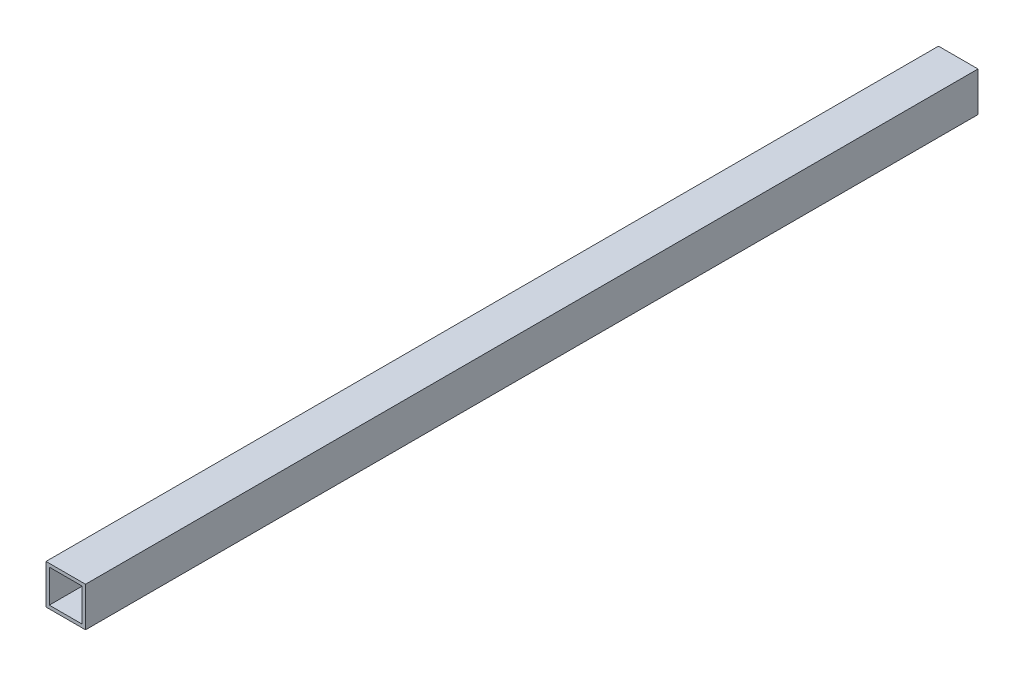
ISO-10303-21;
HEADER;
FILE_DESCRIPTION(('STEP AP214'),'2;1');
FILE_NAME('part.step','',(''),(''),'','','');
FILE_SCHEMA(('AUTOMOTIVE_DESIGN { 1 0 10303 214 1 1 1 1 }'));
ENDSEC;
DATA;
#1=APPLICATION_CONTEXT('core data for automotive mechanical design processes');
#2=APPLICATION_PROTOCOL_DEFINITION('international standard','automotive_design',2000,#1);
#3=PRODUCT_CONTEXT('',#1,'mechanical');
#4=PRODUCT('Part','Part','',(#3));
#5=PRODUCT_RELATED_PRODUCT_CATEGORY('part','',(#4));
#6=PRODUCT_DEFINITION_FORMATION('','',#4);
#7=PRODUCT_DEFINITION_CONTEXT('part definition',#1,'design');
#8=PRODUCT_DEFINITION('design','',#6,#7);
#9=PRODUCT_DEFINITION_SHAPE('','',#8);
#10=(LENGTH_UNIT() NAMED_UNIT(*) SI_UNIT(.MILLI.,.METRE.));
#11=(NAMED_UNIT(*) PLANE_ANGLE_UNIT() SI_UNIT($,.RADIAN.));
#12=(NAMED_UNIT(*) SI_UNIT($,.STERADIAN.) SOLID_ANGLE_UNIT());
#13=UNCERTAINTY_MEASURE_WITH_UNIT(LENGTH_MEASURE(1.E-05),#10,'distance_accuracy_value','');
#14=(GEOMETRIC_REPRESENTATION_CONTEXT(3) GLOBAL_UNCERTAINTY_ASSIGNED_CONTEXT((#13)) GLOBAL_UNIT_ASSIGNED_CONTEXT((#10,
#11,#12)) REPRESENTATION_CONTEXT('',''));
#15=CARTESIAN_POINT('',(0.,0.,0.));
#16=DIRECTION('',(0.,0.,1.));
#17=DIRECTION('',(1.,0.,0.));
#18=AXIS2_PLACEMENT_3D('',#15,#16,#17);
#19=CARTESIAN_POINT('',(0.,0.,542.));
#20=DIRECTION('',(0.,0.,1.));
#21=DIRECTION('',(1.,0.,0.));
#22=AXIS2_PLACEMENT_3D('',#19,#20,#21);
#23=PLANE('',#22);
#24=DIRECTION('',(0.,-1.,0.));
#25=VECTOR('',#24,1.);
#26=CARTESIAN_POINT('',(-12.,12.,542.));
#27=LINE('',#26,#25);
#28=CARTESIAN_POINT('',(-12.,12.,542.));
#29=VERTEX_POINT('',#28);
#30=CARTESIAN_POINT('',(-12.,-12.,542.));
#31=VERTEX_POINT('',#30);
#32=EDGE_CURVE('E136',#29,#31,#27,.T.);
#33=ORIENTED_EDGE('',*,*,#32,.T.);
#34=DIRECTION('',(1.,0.,0.));
#35=VECTOR('',#34,1.);
#36=CARTESIAN_POINT('',(-12.,-12.,542.));
#37=LINE('',#36,#35);
#38=CARTESIAN_POINT('',(12.,-12.,542.));
#39=VERTEX_POINT('',#38);
#40=EDGE_CURVE('E139',#31,#39,#37,.T.);
#41=ORIENTED_EDGE('',*,*,#40,.T.);
#42=DIRECTION('',(0.,1.,0.));
#43=VECTOR('',#42,1.);
#44=CARTESIAN_POINT('',(12.,12.,542.));
#45=LINE('',#44,#43);
#46=CARTESIAN_POINT('',(12.,12.,542.));
#47=VERTEX_POINT('',#46);
#48=EDGE_CURVE('E142',#39,#47,#45,.T.);
#49=ORIENTED_EDGE('',*,*,#48,.T.);
#50=DIRECTION('',(-1.,0.,0.));
#51=VECTOR('',#50,1.);
#52=CARTESIAN_POINT('',(-12.,12.,542.));
#53=LINE('',#52,#51);
#54=EDGE_CURVE('E144',#47,#29,#53,.T.);
#55=ORIENTED_EDGE('',*,*,#54,.T.);
#56=EDGE_LOOP('',(#33,#41,#49,#55));
#57=FACE_BOUND('',#56,.T.);
#58=DIRECTION('',(-1.,0.,0.));
#59=VECTOR('',#58,1.);
#60=CARTESIAN_POINT('',(-10.,10.,542.));
#61=LINE('',#60,#59);
#62=CARTESIAN_POINT('',(10.,10.,542.));
#63=VERTEX_POINT('',#62);
#64=CARTESIAN_POINT('',(-10.,10.,542.));
#65=VERTEX_POINT('',#64);
#66=EDGE_CURVE('E108',#63,#65,#61,.T.);
#67=ORIENTED_EDGE('',*,*,#66,.F.);
#68=DIRECTION('',(0.,1.,0.));
#69=VECTOR('',#68,1.);
#70=CARTESIAN_POINT('',(10.,10.,542.));
#71=LINE('',#70,#69);
#72=CARTESIAN_POINT('',(10.,-10.,542.));
#73=VERTEX_POINT('',#72);
#74=EDGE_CURVE('E100',#73,#63,#71,.T.);
#75=ORIENTED_EDGE('',*,*,#74,.F.);
#76=DIRECTION('',(1.,0.,0.));
#77=VECTOR('',#76,1.);
#78=CARTESIAN_POINT('',(-10.,-10.,542.));
#79=LINE('',#78,#77);
#80=CARTESIAN_POINT('',(-10.,-10.,542.));
#81=VERTEX_POINT('',#80);
#82=EDGE_CURVE('E122',#81,#73,#79,.T.);
#83=ORIENTED_EDGE('',*,*,#82,.F.);
#84=DIRECTION('',(0.,-1.,0.));
#85=VECTOR('',#84,1.);
#86=CARTESIAN_POINT('',(-10.,10.,542.));
#87=LINE('',#86,#85);
#88=EDGE_CURVE('E120',#65,#81,#87,.T.);
#89=ORIENTED_EDGE('',*,*,#88,.F.);
#90=EDGE_LOOP('',(#67,#75,#83,#89));
#91=FACE_BOUND('',#90,.T.);
#92=ADVANCED_FACE('F35',(#57,#91),#23,.T.);
#93=CARTESIAN_POINT('',(0.,0.,0.));
#94=DIRECTION('',(0.,0.,1.));
#95=DIRECTION('',(1.,0.,0.));
#96=AXIS2_PLACEMENT_3D('',#93,#94,#95);
#97=PLANE('',#96);
#98=DIRECTION('',(0.,-1.,0.));
#99=VECTOR('',#98,1.);
#100=CARTESIAN_POINT('',(-12.,12.,0.));
#101=LINE('',#100,#99);
#102=CARTESIAN_POINT('',(-12.,12.,0.));
#103=VERTEX_POINT('',#102);
#104=CARTESIAN_POINT('',(-12.,-12.,0.));
#105=VERTEX_POINT('',#104);
#106=EDGE_CURVE('E116',#103,#105,#101,.T.);
#107=ORIENTED_EDGE('',*,*,#106,.F.);
#108=DIRECTION('',(-1.,0.,0.));
#109=VECTOR('',#108,1.);
#110=CARTESIAN_POINT('',(-12.,12.,0.));
#111=LINE('',#110,#109);
#112=CARTESIAN_POINT('',(12.,12.,0.));
#113=VERTEX_POINT('',#112);
#114=EDGE_CURVE('E140',#113,#103,#111,.T.);
#115=ORIENTED_EDGE('',*,*,#114,.F.);
#116=DIRECTION('',(0.,1.,0.));
#117=VECTOR('',#116,1.);
#118=CARTESIAN_POINT('',(12.,12.,0.));
#119=LINE('',#118,#117);
#120=CARTESIAN_POINT('',(12.,-12.,0.));
#121=VERTEX_POINT('',#120);
#122=EDGE_CURVE('E151',#121,#113,#119,.T.);
#123=ORIENTED_EDGE('',*,*,#122,.F.);
#124=DIRECTION('',(1.,0.,0.));
#125=VECTOR('',#124,1.);
#126=CARTESIAN_POINT('',(-12.,-12.,0.));
#127=LINE('',#126,#125);
#128=EDGE_CURVE('E149',#105,#121,#127,.T.);
#129=ORIENTED_EDGE('',*,*,#128,.F.);
#130=EDGE_LOOP('',(#107,#115,#123,#129));
#131=FACE_BOUND('',#130,.T.);
#132=DIRECTION('',(0.,1.,0.));
#133=VECTOR('',#132,1.);
#134=CARTESIAN_POINT('',(10.,10.,0.));
#135=LINE('',#134,#133);
#136=CARTESIAN_POINT('',(10.,-10.,0.));
#137=VERTEX_POINT('',#136);
#138=CARTESIAN_POINT('',(10.,10.,0.));
#139=VERTEX_POINT('',#138);
#140=EDGE_CURVE('E58',#137,#139,#135,.T.);
#141=ORIENTED_EDGE('',*,*,#140,.T.);
#142=DIRECTION('',(-1.,0.,0.));
#143=VECTOR('',#142,1.);
#144=CARTESIAN_POINT('',(-10.,10.,0.));
#145=LINE('',#144,#143);
#146=CARTESIAN_POINT('',(-10.,10.,0.));
#147=VERTEX_POINT('',#146);
#148=EDGE_CURVE('E115',#139,#147,#145,.T.);
#149=ORIENTED_EDGE('',*,*,#148,.T.);
#150=DIRECTION('',(0.,-1.,0.));
#151=VECTOR('',#150,1.);
#152=CARTESIAN_POINT('',(-10.,10.,0.));
#153=LINE('',#152,#151);
#154=CARTESIAN_POINT('',(-10.,-10.,0.));
#155=VERTEX_POINT('',#154);
#156=EDGE_CURVE('E128',#147,#155,#153,.T.);
#157=ORIENTED_EDGE('',*,*,#156,.T.);
#158=DIRECTION('',(1.,0.,0.));
#159=VECTOR('',#158,1.);
#160=CARTESIAN_POINT('',(-10.,-10.,0.));
#161=LINE('',#160,#159);
#162=EDGE_CURVE('E109',#155,#137,#161,.T.);
#163=ORIENTED_EDGE('',*,*,#162,.T.);
#164=EDGE_LOOP('',(#141,#149,#157,#163));
#165=FACE_BOUND('',#164,.T.);
#166=ADVANCED_FACE('F169',(#131,#165),#97,.F.);
#167=CARTESIAN_POINT('',(-12.,12.,542.));
#168=DIRECTION('',(1.,0.,0.));
#169=DIRECTION('',(0.,1.,0.));
#170=AXIS2_PLACEMENT_3D('',#167,#168,#169);
#171=PLANE('',#170);
#172=ORIENTED_EDGE('',*,*,#106,.T.);
#173=DIRECTION('',(0.,0.,-1.));
#174=VECTOR('',#173,1.);
#175=CARTESIAN_POINT('',(-12.,-12.,542.));
#176=LINE('',#175,#174);
#177=EDGE_CURVE('E11',#31,#105,#176,.T.);
#178=ORIENTED_EDGE('',*,*,#177,.F.);
#179=ORIENTED_EDGE('',*,*,#32,.F.);
#180=DIRECTION('',(0.,0.,-1.));
#181=VECTOR('',#180,1.);
#182=CARTESIAN_POINT('',(-12.,12.,542.));
#183=LINE('',#182,#181);
#184=EDGE_CURVE('E146',#29,#103,#183,.T.);
#185=ORIENTED_EDGE('',*,*,#184,.T.);
#186=EDGE_LOOP('',(#172,#178,#179,#185));
#187=FACE_BOUND('',#186,.T.);
#188=ADVANCED_FACE('F37',(#187),#171,.F.);
#189=CARTESIAN_POINT('',(-12.,-12.,542.));
#190=DIRECTION('',(0.,1.,0.));
#191=DIRECTION('',(-1.,0.,0.));
#192=AXIS2_PLACEMENT_3D('',#189,#190,#191);
#193=PLANE('',#192);
#194=ORIENTED_EDGE('',*,*,#128,.T.);
#195=DIRECTION('',(0.,0.,-1.));
#196=VECTOR('',#195,1.);
#197=CARTESIAN_POINT('',(12.,-12.,542.));
#198=LINE('',#197,#196);
#199=EDGE_CURVE('E43',#39,#121,#198,.T.);
#200=ORIENTED_EDGE('',*,*,#199,.F.);
#201=ORIENTED_EDGE('',*,*,#40,.F.);
#202=ORIENTED_EDGE('',*,*,#177,.T.);
#203=EDGE_LOOP('',(#194,#200,#201,#202));
#204=FACE_BOUND('',#203,.T.);
#205=ADVANCED_FACE('F179',(#204),#193,.F.);
#206=CARTESIAN_POINT('',(12.,12.,542.));
#207=DIRECTION('',(-1.,0.,0.));
#208=DIRECTION('',(0.,-1.,0.));
#209=AXIS2_PLACEMENT_3D('',#206,#207,#208);
#210=PLANE('',#209);
#211=ORIENTED_EDGE('',*,*,#122,.T.);
#212=DIRECTION('',(0.,0.,-1.));
#213=VECTOR('',#212,1.);
#214=CARTESIAN_POINT('',(12.,12.,542.));
#215=LINE('',#214,#213);
#216=EDGE_CURVE('E156',#47,#113,#215,.T.);
#217=ORIENTED_EDGE('',*,*,#216,.F.);
#218=ORIENTED_EDGE('',*,*,#48,.F.);
#219=ORIENTED_EDGE('',*,*,#199,.T.);
#220=EDGE_LOOP('',(#211,#217,#218,#219));
#221=FACE_BOUND('',#220,.T.);
#222=ADVANCED_FACE('F163',(#221),#210,.F.);
#223=CARTESIAN_POINT('',(-12.,12.,542.));
#224=DIRECTION('',(0.,-1.,0.));
#225=DIRECTION('',(0.,0.,-1.));
#226=AXIS2_PLACEMENT_3D('',#223,#224,#225);
#227=PLANE('',#226);
#228=ORIENTED_EDGE('',*,*,#114,.T.);
#229=ORIENTED_EDGE('',*,*,#184,.F.);
#230=ORIENTED_EDGE('',*,*,#54,.F.);
#231=ORIENTED_EDGE('',*,*,#216,.T.);
#232=EDGE_LOOP('',(#228,#229,#230,#231));
#233=FACE_BOUND('',#232,.T.);
#234=ADVANCED_FACE('F173',(#233),#227,.F.);
#235=CARTESIAN_POINT('',(10.,10.,542.));
#236=DIRECTION('',(-1.,0.,0.));
#237=DIRECTION('',(0.,0.,1.));
#238=AXIS2_PLACEMENT_3D('',#235,#236,#237);
#239=PLANE('',#238);
#240=ORIENTED_EDGE('',*,*,#140,.F.);
#241=DIRECTION('',(0.,0.,-1.));
#242=VECTOR('',#241,1.);
#243=CARTESIAN_POINT('',(10.,-10.,542.));
#244=LINE('',#243,#242);
#245=EDGE_CURVE('E104',#73,#137,#244,.T.);
#246=ORIENTED_EDGE('',*,*,#245,.F.);
#247=ORIENTED_EDGE('',*,*,#74,.T.);
#248=DIRECTION('',(0.,0.,-1.));
#249=VECTOR('',#248,1.);
#250=CARTESIAN_POINT('',(10.,10.,542.));
#251=LINE('',#250,#249);
#252=EDGE_CURVE('E103',#63,#139,#251,.T.);
#253=ORIENTED_EDGE('',*,*,#252,.T.);
#254=EDGE_LOOP('',(#240,#246,#247,#253));
#255=FACE_BOUND('',#254,.T.);
#256=ADVANCED_FACE('F102',(#255),#239,.T.);
#257=CARTESIAN_POINT('',(-10.,10.,542.));
#258=DIRECTION('',(0.,-1.,0.));
#259=DIRECTION('',(0.,0.,-1.));
#260=AXIS2_PLACEMENT_3D('',#257,#258,#259);
#261=PLANE('',#260);
#262=ORIENTED_EDGE('',*,*,#148,.F.);
#263=ORIENTED_EDGE('',*,*,#252,.F.);
#264=ORIENTED_EDGE('',*,*,#66,.T.);
#265=DIRECTION('',(0.,0.,-1.));
#266=VECTOR('',#265,1.);
#267=CARTESIAN_POINT('',(-10.,10.,542.));
#268=LINE('',#267,#266);
#269=EDGE_CURVE('E117',#65,#147,#268,.T.);
#270=ORIENTED_EDGE('',*,*,#269,.T.);
#271=EDGE_LOOP('',(#262,#263,#264,#270));
#272=FACE_BOUND('',#271,.T.);
#273=ADVANCED_FACE('F112',(#272),#261,.T.);
#274=CARTESIAN_POINT('',(-10.,10.,542.));
#275=DIRECTION('',(1.,0.,0.));
#276=DIRECTION('',(0.,1.,0.));
#277=AXIS2_PLACEMENT_3D('',#274,#275,#276);
#278=PLANE('',#277);
#279=ORIENTED_EDGE('',*,*,#156,.F.);
#280=ORIENTED_EDGE('',*,*,#269,.F.);
#281=ORIENTED_EDGE('',*,*,#88,.T.);
#282=DIRECTION('',(0.,0.,-1.));
#283=VECTOR('',#282,1.);
#284=CARTESIAN_POINT('',(-10.,-10.,542.));
#285=LINE('',#284,#283);
#286=EDGE_CURVE('E50',#81,#155,#285,.T.);
#287=ORIENTED_EDGE('',*,*,#286,.T.);
#288=EDGE_LOOP('',(#279,#280,#281,#287));
#289=FACE_BOUND('',#288,.T.);
#290=ADVANCED_FACE('F202',(#289),#278,.T.);
#291=CARTESIAN_POINT('',(-10.,-10.,542.));
#292=DIRECTION('',(0.,1.,0.));
#293=DIRECTION('',(0.,0.,1.));
#294=AXIS2_PLACEMENT_3D('',#291,#292,#293);
#295=PLANE('',#294);
#296=ORIENTED_EDGE('',*,*,#162,.F.);
#297=ORIENTED_EDGE('',*,*,#286,.F.);
#298=ORIENTED_EDGE('',*,*,#82,.T.);
#299=ORIENTED_EDGE('',*,*,#245,.T.);
#300=EDGE_LOOP('',(#296,#297,#298,#299));
#301=FACE_BOUND('',#300,.T.);
#302=ADVANCED_FACE('F206',(#301),#295,.T.);
#303=CLOSED_SHELL('',(#92,#166,#188,#205,#222,#234,#256,#273,#290,#302));
#304=MANIFOLD_SOLID_BREP('B2',#303);
#305=ADVANCED_BREP_SHAPE_REPRESENTATION('',(#18,#304),#14);
#306=SHAPE_DEFINITION_REPRESENTATION(#9,#305);
ENDSEC;
END-ISO-10303-21;
